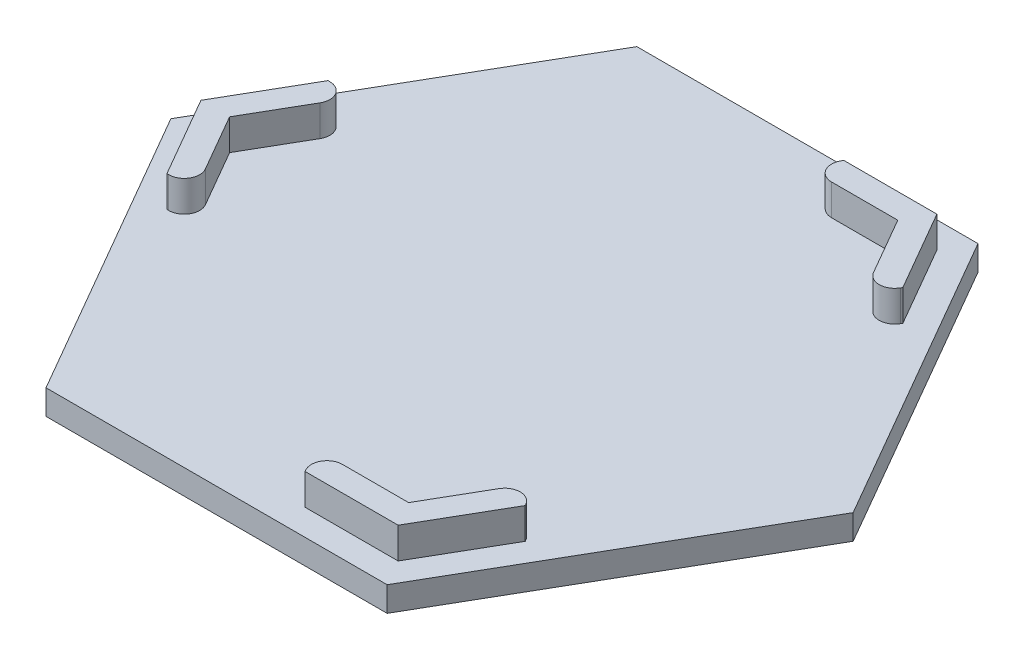
ISO-10303-21;
HEADER;
FILE_DESCRIPTION(('STEP AP214'),'2;1');
FILE_NAME('part.step','',(''),(''),'','','');
FILE_SCHEMA(('AUTOMOTIVE_DESIGN { 1 0 10303 214 1 1 1 1 }'));
ENDSEC;
DATA;
#1=APPLICATION_CONTEXT('core data for automotive mechanical design processes');
#2=APPLICATION_PROTOCOL_DEFINITION('international standard','automotive_design',2000,#1);
#3=PRODUCT_CONTEXT('',#1,'mechanical');
#4=PRODUCT('Part','Part','',(#3));
#5=PRODUCT_RELATED_PRODUCT_CATEGORY('part','',(#4));
#6=PRODUCT_DEFINITION_FORMATION('','',#4);
#7=PRODUCT_DEFINITION_CONTEXT('part definition',#1,'design');
#8=PRODUCT_DEFINITION('design','',#6,#7);
#9=PRODUCT_DEFINITION_SHAPE('','',#8);
#10=(LENGTH_UNIT() NAMED_UNIT(*) SI_UNIT(.MILLI.,.METRE.));
#11=(NAMED_UNIT(*) PLANE_ANGLE_UNIT() SI_UNIT($,.RADIAN.));
#12=(NAMED_UNIT(*) SI_UNIT($,.STERADIAN.) SOLID_ANGLE_UNIT());
#13=UNCERTAINTY_MEASURE_WITH_UNIT(LENGTH_MEASURE(1.E-05),#10,'distance_accuracy_value','');
#14=(GEOMETRIC_REPRESENTATION_CONTEXT(3) GLOBAL_UNCERTAINTY_ASSIGNED_CONTEXT((#13)) GLOBAL_UNIT_ASSIGNED_CONTEXT((#10,
#11,#12)) REPRESENTATION_CONTEXT('',''));
#15=CARTESIAN_POINT('',(0.,0.,0.));
#16=DIRECTION('',(0.,0.,1.));
#17=DIRECTION('',(1.,0.,0.));
#18=AXIS2_PLACEMENT_3D('',#15,#16,#17);
#19=CARTESIAN_POINT('',(0.,2.032,0.));
#20=DIRECTION('',(0.,1.,0.));
#21=DIRECTION('',(0.,0.,1.));
#22=AXIS2_PLACEMENT_3D('',#19,#20,#21);
#23=PLANE('',#22);
#24=DIRECTION('',(0.5,0.,-0.866025403784439));
#25=VECTOR('',#24,1.);
#26=CARTESIAN_POINT('',(13.97,2.032,24.1967497817372));
#27=LINE('',#26,#25);
#28=CARTESIAN_POINT('',(13.97,2.032,24.1967497817372));
#29=VERTEX_POINT('',#28);
#30=CARTESIAN_POINT('',(27.94,2.032,0.));
#31=VERTEX_POINT('',#30);
#32=EDGE_CURVE('E343',#29,#31,#27,.T.);
#33=ORIENTED_EDGE('',*,*,#32,.T.);
#34=DIRECTION('',(-0.5,0.,-0.866025403784439));
#35=VECTOR('',#34,1.);
#36=CARTESIAN_POINT('',(27.94,2.032,0.));
#37=LINE('',#36,#35);
#38=CARTESIAN_POINT('',(13.97,2.032,-24.1967497817372));
#39=VERTEX_POINT('',#38);
#40=EDGE_CURVE('E346',#31,#39,#37,.T.);
#41=ORIENTED_EDGE('',*,*,#40,.T.);
#42=DIRECTION('',(-1.,0.,0.));
#43=VECTOR('',#42,1.);
#44=CARTESIAN_POINT('',(13.97,2.032,-24.1967497817372));
#45=LINE('',#44,#43);
#46=CARTESIAN_POINT('',(-13.97,2.032,-24.1967497817372));
#47=VERTEX_POINT('',#46);
#48=EDGE_CURVE('E349',#39,#47,#45,.T.);
#49=ORIENTED_EDGE('',*,*,#48,.T.);
#50=DIRECTION('',(-0.5,0.,0.866025403784439));
#51=VECTOR('',#50,1.);
#52=CARTESIAN_POINT('',(-13.97,2.032,-24.1967497817372));
#53=LINE('',#52,#51);
#54=CARTESIAN_POINT('',(-27.94,2.032,0.));
#55=VERTEX_POINT('',#54);
#56=EDGE_CURVE('E351',#47,#55,#53,.T.);
#57=ORIENTED_EDGE('',*,*,#56,.T.);
#58=DIRECTION('',(0.5,0.,0.866025403784438));
#59=VECTOR('',#58,1.);
#60=CARTESIAN_POINT('',(-27.94,2.032,0.));
#61=LINE('',#60,#59);
#62=CARTESIAN_POINT('',(-13.97,2.032,24.1967497817372));
#63=VERTEX_POINT('',#62);
#64=EDGE_CURVE('E353',#55,#63,#61,.T.);
#65=ORIENTED_EDGE('',*,*,#64,.T.);
#66=DIRECTION('',(1.,0.,0.));
#67=VECTOR('',#66,1.);
#68=CARTESIAN_POINT('',(-13.97,2.032,24.1967497817372));
#69=LINE('',#68,#67);
#70=EDGE_CURVE('E355',#63,#29,#69,.T.);
#71=ORIENTED_EDGE('',*,*,#70,.T.);
#72=EDGE_LOOP('',(#33,#41,#49,#57,#65,#71));
#73=FACE_BOUND('',#72,.T.);
#74=DIRECTION('',(0.5,0.,-0.866025403784439));
#75=VECTOR('',#74,1.);
#76=CARTESIAN_POINT('',(15.3749897186637,2.032,-13.4320362048998));
#77=LINE('',#76,#75);
#78=CARTESIAN_POINT('',(16.4748419814699,2.032,-15.3370362048998));
#79=VERTEX_POINT('',#78);
#80=CARTESIAN_POINT('',(16.548165465657,2.032,-15.4640362048998));
#81=VERTEX_POINT('',#80);
#82=EDGE_CURVE('E322',#79,#81,#77,.T.);
#83=ORIENTED_EDGE('',*,*,#82,.F.);
#84=CARTESIAN_POINT('',(15.3749897186637,2.032,-15.9720362048998));
#85=DIRECTION('',(0.,1.,0.));
#86=DIRECTION('',(0.,0.,1.));
#87=AXIS2_PLACEMENT_3D('',#84,#85,#86);
#88=CIRCLE('',#87,1.27);
#89=CARTESIAN_POINT('',(14.2751374558575,2.032,-15.3370362048998));
#90=VERTEX_POINT('',#89);
#91=EDGE_CURVE('E41',#79,#90,#88,.F.);
#92=ORIENTED_EDGE('',*,*,#91,.T.);
#93=DIRECTION('',(0.5,0.,0.866025403784438));
#94=VECTOR('',#93,1.);
#95=CARTESIAN_POINT('',(11.5649897186637,2.032,-20.0311497817372));
#96=LINE('',#95,#94);
#97=CARTESIAN_POINT('',(11.5649897186637,2.032,-20.0311497817372));
#98=VERTEX_POINT('',#97);
#99=EDGE_CURVE('E303',#98,#90,#96,.T.);
#100=ORIENTED_EDGE('',*,*,#99,.F.);
#101=DIRECTION('',(1.,0.,0.));
#102=VECTOR('',#101,1.);
#103=CARTESIAN_POINT('',(3.94498971866369,2.032,-20.0311497817372));
#104=LINE('',#103,#102);
#105=CARTESIAN_POINT('',(6.14469424427617,2.032,-20.0311497817372));
#106=VERTEX_POINT('',#105);
#107=EDGE_CURVE('E308',#106,#98,#104,.T.);
#108=ORIENTED_EDGE('',*,*,#107,.F.);
#109=CARTESIAN_POINT('',(6.14469424427617,2.032,-21.3011497817372));
#110=DIRECTION('',(0.,1.,0.));
#111=DIRECTION('',(0.,0.,1.));
#112=AXIS2_PLACEMENT_3D('',#109,#110,#111);
#113=CIRCLE('',#112,1.27);
#114=CARTESIAN_POINT('',(5.04484198146993,2.032,-21.9361497817372));
#115=VERTEX_POINT('',#114);
#116=EDGE_CURVE('E11',#106,#115,#113,.F.);
#117=ORIENTED_EDGE('',*,*,#116,.T.);
#118=DIRECTION('',(-0.499999999999999,0.,0.866025403784439));
#119=VECTOR('',#118,1.);
#120=CARTESIAN_POINT('',(5.11816546565701,2.032,-22.0631497817372));
#121=LINE('',#120,#119);
#122=CARTESIAN_POINT('',(5.11816546565701,2.032,-22.0631497817372));
#123=VERTEX_POINT('',#122);
#124=EDGE_CURVE('E328',#123,#115,#121,.T.);
#125=ORIENTED_EDGE('',*,*,#124,.F.);
#126=DIRECTION('',(-1.,0.,0.));
#127=VECTOR('',#126,1.);
#128=CARTESIAN_POINT('',(5.11816546565701,2.032,-22.0631497817372));
#129=LINE('',#128,#127);
#130=CARTESIAN_POINT('',(12.738165465657,2.032,-22.0631497817372));
#131=VERTEX_POINT('',#130);
#132=EDGE_CURVE('E326',#131,#123,#129,.T.);
#133=ORIENTED_EDGE('',*,*,#132,.F.);
#134=DIRECTION('',(-0.5,0.,-0.866025403784439));
#135=VECTOR('',#134,1.);
#136=CARTESIAN_POINT('',(12.738165465657,2.032,-22.0631497817372));
#137=LINE('',#136,#135);
#138=EDGE_CURVE('E324',#81,#131,#137,.T.);
#139=ORIENTED_EDGE('',*,*,#138,.F.);
#140=EDGE_LOOP('',(#83,#92,#100,#108,#117,#125,#133,#139));
#141=FACE_BOUND('',#140,.T.);
#142=DIRECTION('',(-1.,0.,0.));
#143=VECTOR('',#142,1.);
#144=CARTESIAN_POINT('',(11.5649897186637,2.032,20.0311497817372));
#145=LINE('',#144,#143);
#146=CARTESIAN_POINT('',(11.5649897186637,2.032,20.0311497817372));
#147=VERTEX_POINT('',#146);
#148=CARTESIAN_POINT('',(6.14469424427618,2.032,20.0311497817372));
#149=VERTEX_POINT('',#148);
#150=EDGE_CURVE('E259',#147,#149,#145,.T.);
#151=ORIENTED_EDGE('',*,*,#150,.F.);
#152=DIRECTION('',(-0.499999999999999,0.,0.866025403784439));
#153=VECTOR('',#152,1.);
#154=CARTESIAN_POINT('',(15.3749897186637,2.032,13.4320362048998));
#155=LINE('',#154,#153);
#156=CARTESIAN_POINT('',(14.2751374558575,2.032,15.3370362048998));
#157=VERTEX_POINT('',#156);
#158=EDGE_CURVE('E256',#157,#147,#155,.T.);
#159=ORIENTED_EDGE('',*,*,#158,.F.);
#160=CARTESIAN_POINT('',(15.3749897186637,2.032,15.9720362048998));
#161=DIRECTION('',(0.,1.,0.));
#162=DIRECTION('',(0.,0.,1.));
#163=AXIS2_PLACEMENT_3D('',#160,#161,#162);
#164=CIRCLE('',#163,1.27);
#165=CARTESIAN_POINT('',(16.4748419814699,2.032,15.3370362048998));
#166=VERTEX_POINT('',#165);
#167=EDGE_CURVE('E430',#157,#166,#164,.F.);
#168=ORIENTED_EDGE('',*,*,#167,.T.);
#169=DIRECTION('',(-0.5,0.,-0.866025403784439));
#170=VECTOR('',#169,1.);
#171=CARTESIAN_POINT('',(16.548165465657,2.032,15.4640362048998));
#172=LINE('',#171,#170);
#173=CARTESIAN_POINT('',(16.548165465657,2.032,15.4640362048998));
#174=VERTEX_POINT('',#173);
#175=EDGE_CURVE('E269',#174,#166,#172,.T.);
#176=ORIENTED_EDGE('',*,*,#175,.F.);
#177=DIRECTION('',(0.5,0.,-0.866025403784439));
#178=VECTOR('',#177,1.);
#179=CARTESIAN_POINT('',(16.548165465657,2.032,15.4640362048998));
#180=LINE('',#179,#178);
#181=CARTESIAN_POINT('',(12.738165465657,2.032,22.0631497817372));
#182=VERTEX_POINT('',#181);
#183=EDGE_CURVE('E288',#182,#174,#180,.T.);
#184=ORIENTED_EDGE('',*,*,#183,.F.);
#185=DIRECTION('',(1.,0.,0.));
#186=VECTOR('',#185,1.);
#187=CARTESIAN_POINT('',(12.738165465657,2.032,22.0631497817372));
#188=LINE('',#187,#186);
#189=CARTESIAN_POINT('',(5.11816546565703,2.032,22.0631497817372));
#190=VERTEX_POINT('',#189);
#191=EDGE_CURVE('E286',#190,#182,#188,.T.);
#192=ORIENTED_EDGE('',*,*,#191,.F.);
#193=DIRECTION('',(0.500000000000001,0.,0.866025403784438));
#194=VECTOR('',#193,1.);
#195=CARTESIAN_POINT('',(3.94498971866371,2.032,20.0311497817372));
#196=LINE('',#195,#194);
#197=CARTESIAN_POINT('',(5.04484198146995,2.032,21.9361497817372));
#198=VERTEX_POINT('',#197);
#199=EDGE_CURVE('E284',#198,#190,#196,.T.);
#200=ORIENTED_EDGE('',*,*,#199,.F.);
#201=CARTESIAN_POINT('',(6.14469424427618,2.032,21.3011497817372));
#202=DIRECTION('',(0.,1.,0.));
#203=DIRECTION('',(0.,0.,1.));
#204=AXIS2_PLACEMENT_3D('',#201,#202,#203);
#205=CIRCLE('',#204,1.27);
#206=EDGE_CURVE('E428',#198,#149,#205,.F.);
#207=ORIENTED_EDGE('',*,*,#206,.T.);
#208=EDGE_LOOP('',(#151,#159,#168,#176,#184,#192,#200,#207));
#209=FACE_BOUND('',#208,.T.);
#210=DIRECTION('',(0.5,0.,-0.866025403784439));
#211=VECTOR('',#210,1.);
#212=CARTESIAN_POINT('',(-23.1299794373274,2.032,0.));
#213=LINE('',#212,#211);
#214=CARTESIAN_POINT('',(-23.1299794373274,2.032,0.));
#215=VERTEX_POINT('',#214);
#216=CARTESIAN_POINT('',(-20.4198317001336,2.032,-4.69411357683741));
#217=VERTEX_POINT('',#216);
#218=EDGE_CURVE('E812',#215,#217,#213,.T.);
#219=ORIENTED_EDGE('',*,*,#218,.F.);
#220=DIRECTION('',(-0.500000000000001,0.,-0.866025403784438));
#221=VECTOR('',#220,1.);
#222=CARTESIAN_POINT('',(-19.3199794373274,2.032,6.59911357683744));
#223=LINE('',#222,#221);
#224=CARTESIAN_POINT('',(-20.4198317001336,2.032,4.69411357683744));
#225=VERTEX_POINT('',#224);
#226=EDGE_CURVE('E255',#225,#215,#223,.T.);
#227=ORIENTED_EDGE('',*,*,#226,.F.);
#228=CARTESIAN_POINT('',(-21.5196839629399,2.032,5.32911357683744));
#229=DIRECTION('',(0.,1.,0.));
#230=DIRECTION('',(0.,0.,1.));
#231=AXIS2_PLACEMENT_3D('',#228,#229,#230);
#232=CIRCLE('',#231,1.27);
#233=CARTESIAN_POINT('',(-21.5196839629399,2.032,6.59911357683744));
#234=VERTEX_POINT('',#233);
#235=EDGE_CURVE('E426',#225,#234,#232,.F.);
#236=ORIENTED_EDGE('',*,*,#235,.T.);
#237=DIRECTION('',(1.,0.,0.));
#238=VECTOR('',#237,1.);
#239=CARTESIAN_POINT('',(-21.666330931314,2.032,6.59911357683744));
#240=LINE('',#239,#238);
#241=CARTESIAN_POINT('',(-21.666330931314,2.032,6.59911357683744));
#242=VERTEX_POINT('',#241);
#243=EDGE_CURVE('E241',#242,#234,#240,.T.);
#244=ORIENTED_EDGE('',*,*,#243,.F.);
#245=DIRECTION('',(0.499999999999999,0.,0.866025403784439));
#246=VECTOR('',#245,1.);
#247=CARTESIAN_POINT('',(-21.666330931314,2.032,6.59911357683744));
#248=LINE('',#247,#246);
#249=CARTESIAN_POINT('',(-25.476330931314,2.032,0.));
#250=VERTEX_POINT('',#249);
#251=EDGE_CURVE('E822',#250,#242,#248,.T.);
#252=ORIENTED_EDGE('',*,*,#251,.F.);
#253=DIRECTION('',(-0.499999999999999,0.,0.866025403784439));
#254=VECTOR('',#253,1.);
#255=CARTESIAN_POINT('',(-25.476330931314,2.032,0.));
#256=LINE('',#255,#254);
#257=CARTESIAN_POINT('',(-21.666330931314,2.032,-6.5991135768374));
#258=VERTEX_POINT('',#257);
#259=EDGE_CURVE('E816',#258,#250,#256,.T.);
#260=ORIENTED_EDGE('',*,*,#259,.F.);
#261=DIRECTION('',(-1.,0.,0.));
#262=VECTOR('',#261,1.);
#263=CARTESIAN_POINT('',(-19.3199794373274,2.032,-6.59911357683741));
#264=LINE('',#263,#262);
#265=CARTESIAN_POINT('',(-21.5196839629399,2.032,-6.5991135768374));
#266=VERTEX_POINT('',#265);
#267=EDGE_CURVE('E814',#266,#258,#264,.T.);
#268=ORIENTED_EDGE('',*,*,#267,.F.);
#269=CARTESIAN_POINT('',(-21.5196839629399,2.032,-5.3291135768374));
#270=DIRECTION('',(0.,1.,0.));
#271=DIRECTION('',(0.,0.,1.));
#272=AXIS2_PLACEMENT_3D('',#269,#270,#271);
#273=CIRCLE('',#272,1.27);
#274=EDGE_CURVE('E424',#266,#217,#273,.F.);
#275=ORIENTED_EDGE('',*,*,#274,.T.);
#276=EDGE_LOOP('',(#219,#227,#236,#244,#252,#260,#268,#275));
#277=FACE_BOUND('',#276,.T.);
#278=ADVANCED_FACE('F33',(#73,#141,#209,#277),#23,.T.);
#279=CARTESIAN_POINT('',(13.97,2.032,24.1967497817372));
#280=DIRECTION('',(-0.866025403784439,0.,-0.5));
#281=DIRECTION('',(-0.5,0.,0.866025403784439));
#282=AXIS2_PLACEMENT_3D('',#279,#280,#281);
#283=PLANE('',#282);
#284=DIRECTION('',(0.5,0.,-0.866025403784439));
#285=VECTOR('',#284,1.);
#286=CARTESIAN_POINT('',(13.97,0.,24.1967497817372));
#287=LINE('',#286,#285);
#288=CARTESIAN_POINT('',(13.97,0.,24.1967497817372));
#289=VERTEX_POINT('',#288);
#290=CARTESIAN_POINT('',(27.94,0.,0.));
#291=VERTEX_POINT('',#290);
#292=EDGE_CURVE('E342',#289,#291,#287,.T.);
#293=ORIENTED_EDGE('',*,*,#292,.T.);
#294=DIRECTION('',(0.,-1.,0.));
#295=VECTOR('',#294,1.);
#296=CARTESIAN_POINT('',(27.94,2.032,0.));
#297=LINE('',#296,#295);
#298=EDGE_CURVE('E383',#31,#291,#297,.T.);
#299=ORIENTED_EDGE('',*,*,#298,.F.);
#300=ORIENTED_EDGE('',*,*,#32,.F.);
#301=DIRECTION('',(0.,-1.,0.));
#302=VECTOR('',#301,1.);
#303=CARTESIAN_POINT('',(13.97,2.032,24.1967497817372));
#304=LINE('',#303,#302);
#305=EDGE_CURVE('E357',#29,#289,#304,.T.);
#306=ORIENTED_EDGE('',*,*,#305,.T.);
#307=EDGE_LOOP('',(#293,#299,#300,#306));
#308=FACE_BOUND('',#307,.T.);
#309=ADVANCED_FACE('F476',(#308),#283,.F.);
#310=CARTESIAN_POINT('',(27.94,2.032,0.));
#311=DIRECTION('',(-0.866025403784439,0.,0.5));
#312=DIRECTION('',(0.5,0.,0.866025403784439));
#313=AXIS2_PLACEMENT_3D('',#310,#311,#312);
#314=PLANE('',#313);
#315=DIRECTION('',(-0.5,0.,-0.866025403784439));
#316=VECTOR('',#315,1.);
#317=CARTESIAN_POINT('',(27.94,0.,0.));
#318=LINE('',#317,#316);
#319=CARTESIAN_POINT('',(13.97,0.,-24.1967497817372));
#320=VERTEX_POINT('',#319);
#321=EDGE_CURVE('E360',#291,#320,#318,.T.);
#322=ORIENTED_EDGE('',*,*,#321,.T.);
#323=DIRECTION('',(0.,-1.,0.));
#324=VECTOR('',#323,1.);
#325=CARTESIAN_POINT('',(13.97,2.032,-24.1967497817372));
#326=LINE('',#325,#324);
#327=EDGE_CURVE('E380',#39,#320,#326,.T.);
#328=ORIENTED_EDGE('',*,*,#327,.F.);
#329=ORIENTED_EDGE('',*,*,#40,.F.);
#330=ORIENTED_EDGE('',*,*,#298,.T.);
#331=EDGE_LOOP('',(#322,#328,#329,#330));
#332=FACE_BOUND('',#331,.T.);
#333=ADVANCED_FACE('F482',(#332),#314,.F.);
#334=CARTESIAN_POINT('',(13.97,2.032,-24.1967497817372));
#335=DIRECTION('',(0.,0.,1.));
#336=DIRECTION('',(1.,0.,0.));
#337=AXIS2_PLACEMENT_3D('',#334,#335,#336);
#338=PLANE('',#337);
#339=DIRECTION('',(-1.,0.,0.));
#340=VECTOR('',#339,1.);
#341=CARTESIAN_POINT('',(13.97,0.,-24.1967497817372));
#342=LINE('',#341,#340);
#343=CARTESIAN_POINT('',(-13.97,0.,-24.1967497817372));
#344=VERTEX_POINT('',#343);
#345=EDGE_CURVE('E362',#320,#344,#342,.T.);
#346=ORIENTED_EDGE('',*,*,#345,.T.);
#347=DIRECTION('',(0.,-1.,0.));
#348=VECTOR('',#347,1.);
#349=CARTESIAN_POINT('',(-13.97,2.032,-24.1967497817372));
#350=LINE('',#349,#348);
#351=EDGE_CURVE('E377',#47,#344,#350,.T.);
#352=ORIENTED_EDGE('',*,*,#351,.F.);
#353=ORIENTED_EDGE('',*,*,#48,.F.);
#354=ORIENTED_EDGE('',*,*,#327,.T.);
#355=EDGE_LOOP('',(#346,#352,#353,#354));
#356=FACE_BOUND('',#355,.T.);
#357=ADVANCED_FACE('F503',(#356),#338,.F.);
#358=CARTESIAN_POINT('',(-13.97,2.032,-24.1967497817372));
#359=DIRECTION('',(0.866025403784439,0.,0.5));
#360=DIRECTION('',(0.5,0.,-0.866025403784439));
#361=AXIS2_PLACEMENT_3D('',#358,#359,#360);
#362=PLANE('',#361);
#363=DIRECTION('',(-0.5,0.,0.866025403784439));
#364=VECTOR('',#363,1.);
#365=CARTESIAN_POINT('',(-13.97,0.,-24.1967497817372));
#366=LINE('',#365,#364);
#367=CARTESIAN_POINT('',(-27.94,0.,0.));
#368=VERTEX_POINT('',#367);
#369=EDGE_CURVE('E364',#344,#368,#366,.T.);
#370=ORIENTED_EDGE('',*,*,#369,.T.);
#371=DIRECTION('',(0.,-1.,0.));
#372=VECTOR('',#371,1.);
#373=CARTESIAN_POINT('',(-27.94,2.032,0.));
#374=LINE('',#373,#372);
#375=EDGE_CURVE('E374',#55,#368,#374,.T.);
#376=ORIENTED_EDGE('',*,*,#375,.F.);
#377=ORIENTED_EDGE('',*,*,#56,.F.);
#378=ORIENTED_EDGE('',*,*,#351,.T.);
#379=EDGE_LOOP('',(#370,#376,#377,#378));
#380=FACE_BOUND('',#379,.T.);
#381=ADVANCED_FACE('F499',(#380),#362,.F.);
#382=CARTESIAN_POINT('',(-27.94,2.032,0.));
#383=DIRECTION('',(0.866025403784438,0.,-0.5));
#384=DIRECTION('',(-0.5,0.,-0.866025403784439));
#385=AXIS2_PLACEMENT_3D('',#382,#383,#384);
#386=PLANE('',#385);
#387=DIRECTION('',(0.5,0.,0.866025403784438));
#388=VECTOR('',#387,1.);
#389=CARTESIAN_POINT('',(-27.94,0.,0.));
#390=LINE('',#389,#388);
#391=CARTESIAN_POINT('',(-13.97,0.,24.1967497817372));
#392=VERTEX_POINT('',#391);
#393=EDGE_CURVE('E366',#368,#392,#390,.T.);
#394=ORIENTED_EDGE('',*,*,#393,.T.);
#395=DIRECTION('',(0.,-1.,0.));
#396=VECTOR('',#395,1.);
#397=CARTESIAN_POINT('',(-13.97,2.032,24.1967497817372));
#398=LINE('',#397,#396);
#399=EDGE_CURVE('E371',#63,#392,#398,.T.);
#400=ORIENTED_EDGE('',*,*,#399,.F.);
#401=ORIENTED_EDGE('',*,*,#64,.F.);
#402=ORIENTED_EDGE('',*,*,#375,.T.);
#403=EDGE_LOOP('',(#394,#400,#401,#402));
#404=FACE_BOUND('',#403,.T.);
#405=ADVANCED_FACE('F495',(#404),#386,.F.);
#406=CARTESIAN_POINT('',(-13.97,2.032,24.1967497817372));
#407=DIRECTION('',(0.,0.,-1.));
#408=DIRECTION('',(-1.,0.,0.));
#409=AXIS2_PLACEMENT_3D('',#406,#407,#408);
#410=PLANE('',#409);
#411=DIRECTION('',(1.,0.,0.));
#412=VECTOR('',#411,1.);
#413=CARTESIAN_POINT('',(-13.97,0.,24.1967497817372));
#414=LINE('',#413,#412);
#415=EDGE_CURVE('E347',#392,#289,#414,.T.);
#416=ORIENTED_EDGE('',*,*,#415,.T.);
#417=ORIENTED_EDGE('',*,*,#305,.F.);
#418=ORIENTED_EDGE('',*,*,#70,.F.);
#419=ORIENTED_EDGE('',*,*,#399,.T.);
#420=EDGE_LOOP('',(#416,#417,#418,#419));
#421=FACE_BOUND('',#420,.T.);
#422=ADVANCED_FACE('F491',(#421),#410,.F.);
#423=CARTESIAN_POINT('',(0.,0.,0.));
#424=DIRECTION('',(0.,1.,0.));
#425=DIRECTION('',(0.,0.,1.));
#426=AXIS2_PLACEMENT_3D('',#423,#424,#425);
#427=PLANE('',#426);
#428=ORIENTED_EDGE('',*,*,#292,.F.);
#429=ORIENTED_EDGE('',*,*,#415,.F.);
#430=ORIENTED_EDGE('',*,*,#393,.F.);
#431=ORIENTED_EDGE('',*,*,#369,.F.);
#432=ORIENTED_EDGE('',*,*,#345,.F.);
#433=ORIENTED_EDGE('',*,*,#321,.F.);
#434=EDGE_LOOP('',(#428,#429,#430,#431,#432,#433));
#435=FACE_BOUND('',#434,.T.);
#436=ADVANCED_FACE('F488',(#435),#427,.F.);
#437=CARTESIAN_POINT('',(11.5649897186637,4.572,-20.0311497817372));
#438=DIRECTION('',(0.866025403784438,0.,-0.5));
#439=DIRECTION('',(-0.5,0.,-0.866025403784439));
#440=AXIS2_PLACEMENT_3D('',#437,#438,#439);
#441=PLANE('',#440);
#442=ORIENTED_EDGE('',*,*,#99,.T.);
#443=DIRECTION('',(0.,-1.,0.));
#444=VECTOR('',#443,1.);
#445=CARTESIAN_POINT('',(14.2751374558575,4.572,-15.3370362048998));
#446=LINE('',#445,#444);
#447=CARTESIAN_POINT('',(14.2751374558575,4.572,-15.3370362048998));
#448=VERTEX_POINT('',#447);
#449=EDGE_CURVE('E414',#90,#448,#446,.F.);
#450=ORIENTED_EDGE('',*,*,#449,.T.);
#451=DIRECTION('',(0.5,0.,0.866025403784438));
#452=VECTOR('',#451,1.);
#453=CARTESIAN_POINT('',(11.5649897186637,4.572,-20.0311497817372));
#454=LINE('',#453,#452);
#455=CARTESIAN_POINT('',(11.5649897186637,4.572,-20.0311497817372));
#456=VERTEX_POINT('',#455);
#457=EDGE_CURVE('E304',#456,#448,#454,.T.);
#458=ORIENTED_EDGE('',*,*,#457,.F.);
#459=DIRECTION('',(0.,-1.,0.));
#460=VECTOR('',#459,1.);
#461=CARTESIAN_POINT('',(11.5649897186637,4.572,-20.0311497817372));
#462=LINE('',#461,#460);
#463=EDGE_CURVE('E319',#456,#98,#462,.T.);
#464=ORIENTED_EDGE('',*,*,#463,.T.);
#465=EDGE_LOOP('',(#442,#450,#458,#464));
#466=FACE_BOUND('',#465,.T.);
#467=ADVANCED_FACE('F439',(#466),#441,.F.);
#468=CARTESIAN_POINT('',(15.3749897186637,4.572,-13.4320362048998));
#469=DIRECTION('',(-0.866025403784439,0.,-0.5));
#470=DIRECTION('',(-0.5,0.,0.866025403784439));
#471=AXIS2_PLACEMENT_3D('',#468,#469,#470);
#472=PLANE('',#471);
#473=DIRECTION('',(0.5,0.,-0.866025403784439));
#474=VECTOR('',#473,1.);
#475=CARTESIAN_POINT('',(15.3749897186637,4.572,-13.4320362048998));
#476=LINE('',#475,#474);
#477=CARTESIAN_POINT('',(16.4748419814699,4.572,-15.3370362048998));
#478=VERTEX_POINT('',#477);
#479=CARTESIAN_POINT('',(16.548165465657,4.572,-15.4640362048998));
#480=VERTEX_POINT('',#479);
#481=EDGE_CURVE('E307',#478,#480,#476,.T.);
#482=ORIENTED_EDGE('',*,*,#481,.F.);
#483=DIRECTION('',(0.,-1.,0.));
#484=VECTOR('',#483,1.);
#485=CARTESIAN_POINT('',(16.4748419814699,4.572,-15.3370362048998));
#486=LINE('',#485,#484);
#487=EDGE_CURVE('E411',#478,#79,#486,.T.);
#488=ORIENTED_EDGE('',*,*,#487,.T.);
#489=ORIENTED_EDGE('',*,*,#82,.T.);
#490=DIRECTION('',(0.,-1.,0.));
#491=VECTOR('',#490,1.);
#492=CARTESIAN_POINT('',(16.548165465657,4.572,-15.4640362048998));
#493=LINE('',#492,#491);
#494=EDGE_CURVE('E339',#480,#81,#493,.T.);
#495=ORIENTED_EDGE('',*,*,#494,.F.);
#496=EDGE_LOOP('',(#482,#488,#489,#495));
#497=FACE_BOUND('',#496,.T.);
#498=ADVANCED_FACE('F449',(#497),#472,.F.);
#499=CARTESIAN_POINT('',(12.738165465657,4.572,-22.0631497817372));
#500=DIRECTION('',(-0.866025403784439,0.,0.5));
#501=DIRECTION('',(0.5,0.,0.866025403784439));
#502=AXIS2_PLACEMENT_3D('',#499,#500,#501);
#503=PLANE('',#502);
#504=ORIENTED_EDGE('',*,*,#138,.T.);
#505=DIRECTION('',(0.,-1.,0.));
#506=VECTOR('',#505,1.);
#507=CARTESIAN_POINT('',(12.738165465657,4.572,-22.0631497817372));
#508=LINE('',#507,#506);
#509=CARTESIAN_POINT('',(12.738165465657,4.572,-22.0631497817372));
#510=VERTEX_POINT('',#509);
#511=EDGE_CURVE('E336',#510,#131,#508,.T.);
#512=ORIENTED_EDGE('',*,*,#511,.F.);
#513=DIRECTION('',(-0.5,0.,-0.866025403784439));
#514=VECTOR('',#513,1.);
#515=CARTESIAN_POINT('',(12.738165465657,4.572,-22.0631497817372));
#516=LINE('',#515,#514);
#517=EDGE_CURVE('E310',#480,#510,#516,.T.);
#518=ORIENTED_EDGE('',*,*,#517,.F.);
#519=ORIENTED_EDGE('',*,*,#494,.T.);
#520=EDGE_LOOP('',(#504,#512,#518,#519));
#521=FACE_BOUND('',#520,.T.);
#522=ADVANCED_FACE('F453',(#521),#503,.F.);
#523=CARTESIAN_POINT('',(5.11816546565701,4.572,-22.0631497817372));
#524=DIRECTION('',(0.,0.,1.));
#525=DIRECTION('',(1.,0.,0.));
#526=AXIS2_PLACEMENT_3D('',#523,#524,#525);
#527=PLANE('',#526);
#528=ORIENTED_EDGE('',*,*,#132,.T.);
#529=DIRECTION('',(0.,-1.,0.));
#530=VECTOR('',#529,1.);
#531=CARTESIAN_POINT('',(5.11816546565701,4.572,-22.0631497817372));
#532=LINE('',#531,#530);
#533=CARTESIAN_POINT('',(5.11816546565701,4.572,-22.0631497817372));
#534=VERTEX_POINT('',#533);
#535=EDGE_CURVE('E333',#534,#123,#532,.T.);
#536=ORIENTED_EDGE('',*,*,#535,.F.);
#537=DIRECTION('',(-1.,0.,0.));
#538=VECTOR('',#537,1.);
#539=CARTESIAN_POINT('',(5.11816546565701,4.572,-22.0631497817372));
#540=LINE('',#539,#538);
#541=EDGE_CURVE('E312',#510,#534,#540,.T.);
#542=ORIENTED_EDGE('',*,*,#541,.F.);
#543=ORIENTED_EDGE('',*,*,#511,.T.);
#544=EDGE_LOOP('',(#528,#536,#542,#543));
#545=FACE_BOUND('',#544,.T.);
#546=ADVANCED_FACE('F459',(#545),#527,.F.);
#547=CARTESIAN_POINT('',(5.11816546565701,4.572,-22.0631497817372));
#548=DIRECTION('',(0.866025403784439,0.,0.499999999999999));
#549=DIRECTION('',(0.499999999999999,0.,-0.866025403784439));
#550=AXIS2_PLACEMENT_3D('',#547,#548,#549);
#551=PLANE('',#550);
#552=ORIENTED_EDGE('',*,*,#124,.T.);
#553=DIRECTION('',(0.,-1.,0.));
#554=VECTOR('',#553,1.);
#555=CARTESIAN_POINT('',(5.04484198146993,4.572,-21.9361497817372));
#556=LINE('',#555,#554);
#557=CARTESIAN_POINT('',(5.04484198146993,4.572,-21.9361497817372));
#558=VERTEX_POINT('',#557);
#559=EDGE_CURVE('E422',#115,#558,#556,.F.);
#560=ORIENTED_EDGE('',*,*,#559,.T.);
#561=DIRECTION('',(-0.499999999999999,0.,0.866025403784439));
#562=VECTOR('',#561,1.);
#563=CARTESIAN_POINT('',(5.11816546565701,4.572,-22.0631497817372));
#564=LINE('',#563,#562);
#565=EDGE_CURVE('E314',#534,#558,#564,.T.);
#566=ORIENTED_EDGE('',*,*,#565,.F.);
#567=ORIENTED_EDGE('',*,*,#535,.T.);
#568=EDGE_LOOP('',(#552,#560,#566,#567));
#569=FACE_BOUND('',#568,.T.);
#570=ADVANCED_FACE('F462',(#569),#551,.F.);
#571=CARTESIAN_POINT('',(3.94498971866369,4.572,-20.0311497817372));
#572=DIRECTION('',(0.,0.,-1.));
#573=DIRECTION('',(-1.,0.,0.));
#574=AXIS2_PLACEMENT_3D('',#571,#572,#573);
#575=PLANE('',#574);
#576=DIRECTION('',(1.,0.,0.));
#577=VECTOR('',#576,1.);
#578=CARTESIAN_POINT('',(3.94498971866369,4.572,-20.0311497817372));
#579=LINE('',#578,#577);
#580=CARTESIAN_POINT('',(6.14469424427617,4.572,-20.0311497817372));
#581=VERTEX_POINT('',#580);
#582=EDGE_CURVE('E317',#581,#456,#579,.T.);
#583=ORIENTED_EDGE('',*,*,#582,.F.);
#584=DIRECTION('',(0.,-1.,0.));
#585=VECTOR('',#584,1.);
#586=CARTESIAN_POINT('',(6.14469424427617,4.572,-20.0311497817372));
#587=LINE('',#586,#585);
#588=EDGE_CURVE('E420',#581,#106,#587,.T.);
#589=ORIENTED_EDGE('',*,*,#588,.T.);
#590=ORIENTED_EDGE('',*,*,#107,.T.);
#591=ORIENTED_EDGE('',*,*,#463,.F.);
#592=EDGE_LOOP('',(#583,#589,#590,#591));
#593=FACE_BOUND('',#592,.T.);
#594=ADVANCED_FACE('F465',(#593),#575,.F.);
#595=CARTESIAN_POINT('',(0.,4.572,0.));
#596=DIRECTION('',(0.,1.,0.));
#597=DIRECTION('',(0.,0.,1.));
#598=AXIS2_PLACEMENT_3D('',#595,#596,#597);
#599=PLANE('',#598);
#600=ORIENTED_EDGE('',*,*,#457,.T.);
#601=CARTESIAN_POINT('',(15.3749897186637,4.572,-15.9720362048998));
#602=DIRECTION('',(0.,1.,0.));
#603=DIRECTION('',(0.,0.,1.));
#604=AXIS2_PLACEMENT_3D('',#601,#602,#603);
#605=CIRCLE('',#604,1.27);
#606=EDGE_CURVE('E418',#448,#478,#605,.T.);
#607=ORIENTED_EDGE('',*,*,#606,.T.);
#608=ORIENTED_EDGE('',*,*,#481,.T.);
#609=ORIENTED_EDGE('',*,*,#517,.T.);
#610=ORIENTED_EDGE('',*,*,#541,.T.);
#611=ORIENTED_EDGE('',*,*,#565,.T.);
#612=CARTESIAN_POINT('',(6.14469424427617,4.572,-21.3011497817372));
#613=DIRECTION('',(0.,1.,0.));
#614=DIRECTION('',(0.,0.,1.));
#615=AXIS2_PLACEMENT_3D('',#612,#613,#614);
#616=CIRCLE('',#615,1.27);
#617=EDGE_CURVE('E416',#558,#581,#616,.T.);
#618=ORIENTED_EDGE('',*,*,#617,.T.);
#619=ORIENTED_EDGE('',*,*,#582,.T.);
#620=EDGE_LOOP('',(#600,#607,#608,#609,#610,#611,#618,#619));
#621=FACE_BOUND('',#620,.T.);
#622=ADVANCED_FACE('F446',(#621),#599,.T.);
#623=CARTESIAN_POINT('',(15.3749897186637,4.572,13.4320362048998));
#624=DIRECTION('',(0.866025403784439,0.,0.499999999999999));
#625=DIRECTION('',(0.499999999999999,0.,-0.866025403784439));
#626=AXIS2_PLACEMENT_3D('',#623,#624,#625);
#627=PLANE('',#626);
#628=DIRECTION('',(-0.499999999999999,0.,0.866025403784439));
#629=VECTOR('',#628,1.);
#630=CARTESIAN_POINT('',(15.3749897186637,4.572,13.4320362048998));
#631=LINE('',#630,#629);
#632=CARTESIAN_POINT('',(14.2751374558575,4.572,15.3370362048998));
#633=VERTEX_POINT('',#632);
#634=CARTESIAN_POINT('',(11.5649897186637,4.572,20.0311497817372));
#635=VERTEX_POINT('',#634);
#636=EDGE_CURVE('E266',#633,#635,#631,.T.);
#637=ORIENTED_EDGE('',*,*,#636,.F.);
#638=DIRECTION('',(0.,-1.,0.));
#639=VECTOR('',#638,1.);
#640=CARTESIAN_POINT('',(14.2751374558575,4.572,15.3370362048998));
#641=LINE('',#640,#639);
#642=EDGE_CURVE('E406',#633,#157,#641,.T.);
#643=ORIENTED_EDGE('',*,*,#642,.T.);
#644=ORIENTED_EDGE('',*,*,#158,.T.);
#645=DIRECTION('',(0.,-1.,0.));
#646=VECTOR('',#645,1.);
#647=CARTESIAN_POINT('',(11.5649897186637,4.572,20.0311497817372));
#648=LINE('',#647,#646);
#649=EDGE_CURVE('E300',#635,#147,#648,.T.);
#650=ORIENTED_EDGE('',*,*,#649,.F.);
#651=EDGE_LOOP('',(#637,#643,#644,#650));
#652=FACE_BOUND('',#651,.T.);
#653=ADVANCED_FACE('F472',(#652),#627,.F.);
#654=CARTESIAN_POINT('',(11.5649897186637,4.572,20.0311497817372));
#655=DIRECTION('',(0.,0.,1.));
#656=DIRECTION('',(1.,0.,0.));
#657=AXIS2_PLACEMENT_3D('',#654,#655,#656);
#658=PLANE('',#657);
#659=ORIENTED_EDGE('',*,*,#150,.T.);
#660=DIRECTION('',(0.,-1.,0.));
#661=VECTOR('',#660,1.);
#662=CARTESIAN_POINT('',(6.14469424427618,4.572,20.0311497817372));
#663=LINE('',#662,#661);
#664=CARTESIAN_POINT('',(6.14469424427618,4.572,20.0311497817372));
#665=VERTEX_POINT('',#664);
#666=EDGE_CURVE('E400',#149,#665,#663,.F.);
#667=ORIENTED_EDGE('',*,*,#666,.T.);
#668=DIRECTION('',(-1.,0.,0.));
#669=VECTOR('',#668,1.);
#670=CARTESIAN_POINT('',(11.5649897186637,4.572,20.0311497817372));
#671=LINE('',#670,#669);
#672=EDGE_CURVE('E268',#635,#665,#671,.T.);
#673=ORIENTED_EDGE('',*,*,#672,.F.);
#674=ORIENTED_EDGE('',*,*,#649,.T.);
#675=EDGE_LOOP('',(#659,#667,#673,#674));
#676=FACE_BOUND('',#675,.T.);
#677=ADVANCED_FACE('F644',(#676),#658,.F.);
#678=CARTESIAN_POINT('',(3.94498971866371,4.572,20.0311497817372));
#679=DIRECTION('',(0.866025403784438,0.,-0.500000000000001));
#680=DIRECTION('',(-0.500000000000001,0.,-0.866025403784438));
#681=AXIS2_PLACEMENT_3D('',#678,#679,#680);
#682=PLANE('',#681);
#683=DIRECTION('',(0.500000000000001,0.,0.866025403784438));
#684=VECTOR('',#683,1.);
#685=CARTESIAN_POINT('',(3.94498971866371,4.572,20.0311497817372));
#686=LINE('',#685,#684);
#687=CARTESIAN_POINT('',(5.04484198146995,4.572,21.9361497817372));
#688=VERTEX_POINT('',#687);
#689=CARTESIAN_POINT('',(5.11816546565703,4.572,22.0631497817372));
#690=VERTEX_POINT('',#689);
#691=EDGE_CURVE('E272',#688,#690,#686,.T.);
#692=ORIENTED_EDGE('',*,*,#691,.F.);
#693=DIRECTION('',(0.,-1.,0.));
#694=VECTOR('',#693,1.);
#695=CARTESIAN_POINT('',(5.04484198146995,4.572,21.9361497817372));
#696=LINE('',#695,#694);
#697=EDGE_CURVE('E397',#688,#198,#696,.T.);
#698=ORIENTED_EDGE('',*,*,#697,.T.);
#699=ORIENTED_EDGE('',*,*,#199,.T.);
#700=DIRECTION('',(0.,-1.,0.));
#701=VECTOR('',#700,1.);
#702=CARTESIAN_POINT('',(5.11816546565703,4.572,22.0631497817372));
#703=LINE('',#702,#701);
#704=EDGE_CURVE('E297',#690,#190,#703,.T.);
#705=ORIENTED_EDGE('',*,*,#704,.F.);
#706=EDGE_LOOP('',(#692,#698,#699,#705));
#707=FACE_BOUND('',#706,.T.);
#708=ADVANCED_FACE('F638',(#707),#682,.F.);
#709=CARTESIAN_POINT('',(12.738165465657,4.572,22.0631497817372));
#710=DIRECTION('',(0.,0.,-1.));
#711=DIRECTION('',(-1.,0.,0.));
#712=AXIS2_PLACEMENT_3D('',#709,#710,#711);
#713=PLANE('',#712);
#714=ORIENTED_EDGE('',*,*,#191,.T.);
#715=DIRECTION('',(0.,-1.,0.));
#716=VECTOR('',#715,1.);
#717=CARTESIAN_POINT('',(12.738165465657,4.572,22.0631497817372));
#718=LINE('',#717,#716);
#719=CARTESIAN_POINT('',(12.738165465657,4.572,22.0631497817372));
#720=VERTEX_POINT('',#719);
#721=EDGE_CURVE('E294',#720,#182,#718,.T.);
#722=ORIENTED_EDGE('',*,*,#721,.F.);
#723=DIRECTION('',(1.,0.,0.));
#724=VECTOR('',#723,1.);
#725=CARTESIAN_POINT('',(12.738165465657,4.572,22.0631497817372));
#726=LINE('',#725,#724);
#727=EDGE_CURVE('E274',#690,#720,#726,.T.);
#728=ORIENTED_EDGE('',*,*,#727,.F.);
#729=ORIENTED_EDGE('',*,*,#704,.T.);
#730=EDGE_LOOP('',(#714,#722,#728,#729));
#731=FACE_BOUND('',#730,.T.);
#732=ADVANCED_FACE('F643',(#731),#713,.F.);
#733=CARTESIAN_POINT('',(16.548165465657,4.572,15.4640362048998));
#734=DIRECTION('',(-0.866025403784439,0.,-0.5));
#735=DIRECTION('',(-0.5,0.,0.866025403784439));
#736=AXIS2_PLACEMENT_3D('',#733,#734,#735);
#737=PLANE('',#736);
#738=ORIENTED_EDGE('',*,*,#183,.T.);
#739=DIRECTION('',(0.,-1.,0.));
#740=VECTOR('',#739,1.);
#741=CARTESIAN_POINT('',(16.548165465657,4.572,15.4640362048998));
#742=LINE('',#741,#740);
#743=CARTESIAN_POINT('',(16.548165465657,4.572,15.4640362048998));
#744=VERTEX_POINT('',#743);
#745=EDGE_CURVE('E280',#744,#174,#742,.T.);
#746=ORIENTED_EDGE('',*,*,#745,.F.);
#747=DIRECTION('',(0.5,0.,-0.866025403784439));
#748=VECTOR('',#747,1.);
#749=CARTESIAN_POINT('',(16.548165465657,4.572,15.4640362048998));
#750=LINE('',#749,#748);
#751=EDGE_CURVE('E276',#720,#744,#750,.T.);
#752=ORIENTED_EDGE('',*,*,#751,.F.);
#753=ORIENTED_EDGE('',*,*,#721,.T.);
#754=EDGE_LOOP('',(#738,#746,#752,#753));
#755=FACE_BOUND('',#754,.T.);
#756=ADVANCED_FACE('F630',(#755),#737,.F.);
#757=CARTESIAN_POINT('',(16.548165465657,4.572,15.4640362048998));
#758=DIRECTION('',(-0.866025403784439,0.,0.5));
#759=DIRECTION('',(0.5,0.,0.866025403784439));
#760=AXIS2_PLACEMENT_3D('',#757,#758,#759);
#761=PLANE('',#760);
#762=ORIENTED_EDGE('',*,*,#175,.T.);
#763=DIRECTION('',(0.,-1.,0.));
#764=VECTOR('',#763,1.);
#765=CARTESIAN_POINT('',(16.4748419814699,4.572,15.3370362048998));
#766=LINE('',#765,#764);
#767=CARTESIAN_POINT('',(16.4748419814699,4.572,15.3370362048998));
#768=VERTEX_POINT('',#767);
#769=EDGE_CURVE('E409',#166,#768,#766,.F.);
#770=ORIENTED_EDGE('',*,*,#769,.T.);
#771=DIRECTION('',(-0.5,0.,-0.866025403784439));
#772=VECTOR('',#771,1.);
#773=CARTESIAN_POINT('',(16.548165465657,4.572,15.4640362048998));
#774=LINE('',#773,#772);
#775=EDGE_CURVE('E278',#744,#768,#774,.T.);
#776=ORIENTED_EDGE('',*,*,#775,.F.);
#777=ORIENTED_EDGE('',*,*,#745,.T.);
#778=EDGE_LOOP('',(#762,#770,#776,#777));
#779=FACE_BOUND('',#778,.T.);
#780=ADVANCED_FACE('F620',(#779),#761,.F.);
#781=CARTESIAN_POINT('',(0.,4.572,0.));
#782=DIRECTION('',(0.,-1.,0.));
#783=DIRECTION('',(0.,0.,-1.));
#784=AXIS2_PLACEMENT_3D('',#781,#782,#783);
#785=PLANE('',#784);
#786=ORIENTED_EDGE('',*,*,#672,.T.);
#787=CARTESIAN_POINT('',(6.14469424427618,4.572,21.3011497817372));
#788=DIRECTION('',(0.,-1.,0.));
#789=DIRECTION('',(0.,0.,-1.));
#790=AXIS2_PLACEMENT_3D('',#787,#788,#789);
#791=CIRCLE('',#790,1.27);
#792=EDGE_CURVE('E404',#665,#688,#791,.F.);
#793=ORIENTED_EDGE('',*,*,#792,.T.);
#794=ORIENTED_EDGE('',*,*,#691,.T.);
#795=ORIENTED_EDGE('',*,*,#727,.T.);
#796=ORIENTED_EDGE('',*,*,#751,.T.);
#797=ORIENTED_EDGE('',*,*,#775,.T.);
#798=CARTESIAN_POINT('',(15.3749897186637,4.572,15.9720362048998));
#799=DIRECTION('',(0.,-1.,0.));
#800=DIRECTION('',(0.,0.,-1.));
#801=AXIS2_PLACEMENT_3D('',#798,#799,#800);
#802=CIRCLE('',#801,1.27);
#803=EDGE_CURVE('E402',#768,#633,#802,.F.);
#804=ORIENTED_EDGE('',*,*,#803,.T.);
#805=ORIENTED_EDGE('',*,*,#636,.T.);
#806=EDGE_LOOP('',(#786,#793,#794,#795,#796,#797,#804,#805));
#807=FACE_BOUND('',#806,.T.);
#808=ADVANCED_FACE('F611',(#807),#785,.F.);
#809=CARTESIAN_POINT('',(-19.3199794373274,4.572,6.59911357683744));
#810=DIRECTION('',(-0.866025403784438,0.,0.500000000000001));
#811=DIRECTION('',(0.500000000000001,0.,0.866025403784438));
#812=AXIS2_PLACEMENT_3D('',#809,#810,#811);
#813=PLANE('',#812);
#814=DIRECTION('',(-0.500000000000001,0.,-0.866025403784438));
#815=VECTOR('',#814,1.);
#816=CARTESIAN_POINT('',(-19.3199794373274,4.572,6.59911357683744));
#817=LINE('',#816,#815);
#818=CARTESIAN_POINT('',(-20.4198317001336,4.572,4.69411357683744));
#819=VERTEX_POINT('',#818);
#820=CARTESIAN_POINT('',(-23.1299794373274,4.572,0.));
#821=VERTEX_POINT('',#820);
#822=EDGE_CURVE('E229',#819,#821,#817,.T.);
#823=ORIENTED_EDGE('',*,*,#822,.F.);
#824=DIRECTION('',(0.,-1.,0.));
#825=VECTOR('',#824,1.);
#826=CARTESIAN_POINT('',(-20.4198317001336,4.572,4.69411357683744));
#827=LINE('',#826,#825);
#828=EDGE_CURVE('E393',#819,#225,#827,.T.);
#829=ORIENTED_EDGE('',*,*,#828,.T.);
#830=ORIENTED_EDGE('',*,*,#226,.T.);
#831=DIRECTION('',(0.,-1.,0.));
#832=VECTOR('',#831,1.);
#833=CARTESIAN_POINT('',(-23.1299794373274,4.572,0.));
#834=LINE('',#833,#832);
#835=EDGE_CURVE('E247',#821,#215,#834,.T.);
#836=ORIENTED_EDGE('',*,*,#835,.F.);
#837=EDGE_LOOP('',(#823,#829,#830,#836));
#838=FACE_BOUND('',#837,.T.);
#839=ADVANCED_FACE('F253',(#838),#813,.F.);
#840=CARTESIAN_POINT('',(-23.1299794373274,4.572,0.));
#841=DIRECTION('',(-0.866025403784439,0.,-0.499999999999999));
#842=DIRECTION('',(-0.5,0.,0.866025403784439));
#843=AXIS2_PLACEMENT_3D('',#840,#841,#842);
#844=PLANE('',#843);
#845=ORIENTED_EDGE('',*,*,#218,.T.);
#846=DIRECTION('',(0.,-1.,0.));
#847=VECTOR('',#846,1.);
#848=CARTESIAN_POINT('',(-20.4198317001336,4.572,-4.69411357683741));
#849=LINE('',#848,#847);
#850=CARTESIAN_POINT('',(-20.4198317001336,4.572,-4.69411357683741));
#851=VERTEX_POINT('',#850);
#852=EDGE_CURVE('E250',#217,#851,#849,.F.);
#853=ORIENTED_EDGE('',*,*,#852,.T.);
#854=DIRECTION('',(0.5,0.,-0.866025403784439));
#855=VECTOR('',#854,1.);
#856=CARTESIAN_POINT('',(-23.1299794373274,4.572,0.));
#857=LINE('',#856,#855);
#858=EDGE_CURVE('E232',#821,#851,#857,.T.);
#859=ORIENTED_EDGE('',*,*,#858,.F.);
#860=ORIENTED_EDGE('',*,*,#835,.T.);
#861=EDGE_LOOP('',(#845,#853,#859,#860));
#862=FACE_BOUND('',#861,.T.);
#863=ADVANCED_FACE('F246',(#862),#844,.F.);
#864=CARTESIAN_POINT('',(-19.3199794373274,4.572,-6.59911357683741));
#865=DIRECTION('',(0.,0.,1.));
#866=DIRECTION('',(1.,0.,0.));
#867=AXIS2_PLACEMENT_3D('',#864,#865,#866);
#868=PLANE('',#867);
#869=DIRECTION('',(-1.,0.,0.));
#870=VECTOR('',#869,1.);
#871=CARTESIAN_POINT('',(-19.3199794373274,4.572,-6.59911357683741));
#872=LINE('',#871,#870);
#873=CARTESIAN_POINT('',(-21.5196839629399,4.572,-6.5991135768374));
#874=VERTEX_POINT('',#873);
#875=CARTESIAN_POINT('',(-21.666330931314,4.572,-6.5991135768374));
#876=VERTEX_POINT('',#875);
#877=EDGE_CURVE('E251',#874,#876,#872,.T.);
#878=ORIENTED_EDGE('',*,*,#877,.F.);
#879=DIRECTION('',(0.,-1.,0.));
#880=VECTOR('',#879,1.);
#881=CARTESIAN_POINT('',(-21.5196839629399,4.572,-6.5991135768374));
#882=LINE('',#881,#880);
#883=EDGE_CURVE('E386',#874,#266,#882,.T.);
#884=ORIENTED_EDGE('',*,*,#883,.T.);
#885=ORIENTED_EDGE('',*,*,#267,.T.);
#886=DIRECTION('',(0.,-1.,0.));
#887=VECTOR('',#886,1.);
#888=CARTESIAN_POINT('',(-21.666330931314,4.572,-6.5991135768374));
#889=LINE('',#888,#887);
#890=EDGE_CURVE('E257',#876,#258,#889,.T.);
#891=ORIENTED_EDGE('',*,*,#890,.F.);
#892=EDGE_LOOP('',(#878,#884,#885,#891));
#893=FACE_BOUND('',#892,.T.);
#894=ADVANCED_FACE('F586',(#893),#868,.F.);
#895=CARTESIAN_POINT('',(-25.476330931314,4.572,0.));
#896=DIRECTION('',(0.866025403784439,0.,0.499999999999999));
#897=DIRECTION('',(0.5,0.,-0.866025403784439));
#898=AXIS2_PLACEMENT_3D('',#895,#896,#897);
#899=PLANE('',#898);
#900=ORIENTED_EDGE('',*,*,#259,.T.);
#901=DIRECTION('',(0.,-1.,0.));
#902=VECTOR('',#901,1.);
#903=CARTESIAN_POINT('',(-25.476330931314,4.572,0.));
#904=LINE('',#903,#902);
#905=CARTESIAN_POINT('',(-25.476330931314,4.572,0.));
#906=VERTEX_POINT('',#905);
#907=EDGE_CURVE('E262',#906,#250,#904,.T.);
#908=ORIENTED_EDGE('',*,*,#907,.F.);
#909=DIRECTION('',(-0.499999999999999,0.,0.866025403784439));
#910=VECTOR('',#909,1.);
#911=CARTESIAN_POINT('',(-25.476330931314,4.572,0.));
#912=LINE('',#911,#910);
#913=EDGE_CURVE('E840',#876,#906,#912,.T.);
#914=ORIENTED_EDGE('',*,*,#913,.F.);
#915=ORIENTED_EDGE('',*,*,#890,.T.);
#916=EDGE_LOOP('',(#900,#908,#914,#915));
#917=FACE_BOUND('',#916,.T.);
#918=ADVANCED_FACE('F591',(#917),#899,.F.);
#919=CARTESIAN_POINT('',(-21.666330931314,4.572,6.59911357683744));
#920=DIRECTION('',(0.866025403784439,0.,-0.499999999999999));
#921=DIRECTION('',(-0.5,0.,-0.866025403784439));
#922=AXIS2_PLACEMENT_3D('',#919,#920,#921);
#923=PLANE('',#922);
#924=ORIENTED_EDGE('',*,*,#251,.T.);
#925=DIRECTION('',(0.,-1.,0.));
#926=VECTOR('',#925,1.);
#927=CARTESIAN_POINT('',(-21.666330931314,4.572,6.59911357683744));
#928=LINE('',#927,#926);
#929=CARTESIAN_POINT('',(-21.666330931314,4.572,6.59911357683744));
#930=VERTEX_POINT('',#929);
#931=EDGE_CURVE('E827',#930,#242,#928,.T.);
#932=ORIENTED_EDGE('',*,*,#931,.F.);
#933=DIRECTION('',(0.499999999999999,0.,0.866025403784439));
#934=VECTOR('',#933,1.);
#935=CARTESIAN_POINT('',(-21.666330931314,4.572,6.59911357683744));
#936=LINE('',#935,#934);
#937=EDGE_CURVE('E835',#906,#930,#936,.T.);
#938=ORIENTED_EDGE('',*,*,#937,.F.);
#939=ORIENTED_EDGE('',*,*,#907,.T.);
#940=EDGE_LOOP('',(#924,#932,#938,#939));
#941=FACE_BOUND('',#940,.T.);
#942=ADVANCED_FACE('F578',(#941),#923,.F.);
#943=CARTESIAN_POINT('',(-21.666330931314,4.572,6.59911357683744));
#944=DIRECTION('',(0.,0.,-1.));
#945=DIRECTION('',(-1.,0.,0.));
#946=AXIS2_PLACEMENT_3D('',#943,#944,#945);
#947=PLANE('',#946);
#948=ORIENTED_EDGE('',*,*,#243,.T.);
#949=DIRECTION('',(0.,-1.,0.));
#950=VECTOR('',#949,1.);
#951=CARTESIAN_POINT('',(-21.5196839629399,4.572,6.59911357683744));
#952=LINE('',#951,#950);
#953=CARTESIAN_POINT('',(-21.5196839629399,4.572,6.59911357683744));
#954=VERTEX_POINT('',#953);
#955=EDGE_CURVE('E395',#234,#954,#952,.F.);
#956=ORIENTED_EDGE('',*,*,#955,.T.);
#957=DIRECTION('',(1.,0.,0.));
#958=VECTOR('',#957,1.);
#959=CARTESIAN_POINT('',(-21.666330931314,4.572,6.59911357683744));
#960=LINE('',#959,#958);
#961=EDGE_CURVE('E828',#930,#954,#960,.T.);
#962=ORIENTED_EDGE('',*,*,#961,.F.);
#963=ORIENTED_EDGE('',*,*,#931,.T.);
#964=EDGE_LOOP('',(#948,#956,#962,#963));
#965=FACE_BOUND('',#964,.T.);
#966=ADVANCED_FACE('F569',(#965),#947,.F.);
#967=CARTESIAN_POINT('',(0.,4.572,0.));
#968=DIRECTION('',(0.,-1.,0.));
#969=DIRECTION('',(0.,0.,-1.));
#970=AXIS2_PLACEMENT_3D('',#967,#968,#969);
#971=PLANE('',#970);
#972=ORIENTED_EDGE('',*,*,#858,.T.);
#973=CARTESIAN_POINT('',(-21.5196839629399,4.572,-5.3291135768374));
#974=DIRECTION('',(0.,-1.,0.));
#975=DIRECTION('',(0.,0.,-1.));
#976=AXIS2_PLACEMENT_3D('',#973,#974,#975);
#977=CIRCLE('',#976,1.27);
#978=EDGE_CURVE('E391',#851,#874,#977,.F.);
#979=ORIENTED_EDGE('',*,*,#978,.T.);
#980=ORIENTED_EDGE('',*,*,#877,.T.);
#981=ORIENTED_EDGE('',*,*,#913,.T.);
#982=ORIENTED_EDGE('',*,*,#937,.T.);
#983=ORIENTED_EDGE('',*,*,#961,.T.);
#984=CARTESIAN_POINT('',(-21.5196839629399,4.572,5.32911357683744));
#985=DIRECTION('',(0.,-1.,0.));
#986=DIRECTION('',(0.,0.,-1.));
#987=AXIS2_PLACEMENT_3D('',#984,#985,#986);
#988=CIRCLE('',#987,1.27);
#989=EDGE_CURVE('E236',#954,#819,#988,.F.);
#990=ORIENTED_EDGE('',*,*,#989,.T.);
#991=ORIENTED_EDGE('',*,*,#822,.T.);
#992=EDGE_LOOP('',(#972,#979,#980,#981,#982,#983,#990,#991));
#993=FACE_BOUND('',#992,.T.);
#994=ADVANCED_FACE('F231',(#993),#971,.F.);
#995=CARTESIAN_POINT('',(-21.5196839629399,4.572,-5.3291135768374));
#996=DIRECTION('',(0.,-1.,0.));
#997=DIRECTION('',(0.,0.,-1.));
#998=AXIS2_PLACEMENT_3D('',#995,#996,#997);
#999=CYLINDRICAL_SURFACE('',#998,1.27);
#1000=ORIENTED_EDGE('',*,*,#978,.F.);
#1001=ORIENTED_EDGE('',*,*,#852,.F.);
#1002=ORIENTED_EDGE('',*,*,#274,.F.);
#1003=ORIENTED_EDGE('',*,*,#883,.F.);
#1004=EDGE_LOOP('',(#1000,#1001,#1002,#1003));
#1005=FACE_BOUND('',#1004,.T.);
#1006=ADVANCED_FACE('F511',(#1005),#999,.T.);
#1007=CARTESIAN_POINT('',(-21.5196839629399,4.572,5.32911357683744));
#1008=DIRECTION('',(0.,-1.,0.));
#1009=DIRECTION('',(0.,0.,-1.));
#1010=AXIS2_PLACEMENT_3D('',#1007,#1008,#1009);
#1011=CYLINDRICAL_SURFACE('',#1010,1.27);
#1012=ORIENTED_EDGE('',*,*,#989,.F.);
#1013=ORIENTED_EDGE('',*,*,#955,.F.);
#1014=ORIENTED_EDGE('',*,*,#235,.F.);
#1015=ORIENTED_EDGE('',*,*,#828,.F.);
#1016=EDGE_LOOP('',(#1012,#1013,#1014,#1015));
#1017=FACE_BOUND('',#1016,.T.);
#1018=ADVANCED_FACE('F514',(#1017),#1011,.T.);
#1019=CARTESIAN_POINT('',(6.14469424427618,4.572,21.3011497817372));
#1020=DIRECTION('',(0.,-1.,0.));
#1021=DIRECTION('',(0.,0.,-1.));
#1022=AXIS2_PLACEMENT_3D('',#1019,#1020,#1021);
#1023=CYLINDRICAL_SURFACE('',#1022,1.27);
#1024=ORIENTED_EDGE('',*,*,#792,.F.);
#1025=ORIENTED_EDGE('',*,*,#666,.F.);
#1026=ORIENTED_EDGE('',*,*,#206,.F.);
#1027=ORIENTED_EDGE('',*,*,#697,.F.);
#1028=EDGE_LOOP('',(#1024,#1025,#1026,#1027));
#1029=FACE_BOUND('',#1028,.T.);
#1030=ADVANCED_FACE('F518',(#1029),#1023,.T.);
#1031=CARTESIAN_POINT('',(15.3749897186637,4.572,15.9720362048998));
#1032=DIRECTION('',(0.,-1.,0.));
#1033=DIRECTION('',(0.,0.,-1.));
#1034=AXIS2_PLACEMENT_3D('',#1031,#1032,#1033);
#1035=CYLINDRICAL_SURFACE('',#1034,1.27);
#1036=ORIENTED_EDGE('',*,*,#803,.F.);
#1037=ORIENTED_EDGE('',*,*,#769,.F.);
#1038=ORIENTED_EDGE('',*,*,#167,.F.);
#1039=ORIENTED_EDGE('',*,*,#642,.F.);
#1040=EDGE_LOOP('',(#1036,#1037,#1038,#1039));
#1041=FACE_BOUND('',#1040,.T.);
#1042=ADVANCED_FACE('F522',(#1041),#1035,.T.);
#1043=CARTESIAN_POINT('',(15.3749897186637,4.572,-15.9720362048998));
#1044=DIRECTION('',(0.,-1.,0.));
#1045=DIRECTION('',(0.,0.,-1.));
#1046=AXIS2_PLACEMENT_3D('',#1043,#1044,#1045);
#1047=CYLINDRICAL_SURFACE('',#1046,1.27);
#1048=ORIENTED_EDGE('',*,*,#606,.F.);
#1049=ORIENTED_EDGE('',*,*,#449,.F.);
#1050=ORIENTED_EDGE('',*,*,#91,.F.);
#1051=ORIENTED_EDGE('',*,*,#487,.F.);
#1052=EDGE_LOOP('',(#1048,#1049,#1050,#1051));
#1053=FACE_BOUND('',#1052,.T.);
#1054=ADVANCED_FACE('F443',(#1053),#1047,.T.);
#1055=CARTESIAN_POINT('',(6.14469424427617,4.572,-21.3011497817372));
#1056=DIRECTION('',(0.,-1.,0.));
#1057=DIRECTION('',(0.,0.,-1.));
#1058=AXIS2_PLACEMENT_3D('',#1055,#1056,#1057);
#1059=CYLINDRICAL_SURFACE('',#1058,1.27);
#1060=ORIENTED_EDGE('',*,*,#617,.F.);
#1061=ORIENTED_EDGE('',*,*,#559,.F.);
#1062=ORIENTED_EDGE('',*,*,#116,.F.);
#1063=ORIENTED_EDGE('',*,*,#588,.F.);
#1064=EDGE_LOOP('',(#1060,#1061,#1062,#1063));
#1065=FACE_BOUND('',#1064,.T.);
#1066=ADVANCED_FACE('F35',(#1065),#1059,.T.);
#1067=CLOSED_SHELL('',(#278,#309,#333,#357,#381,#405,#422,#436,#467,#498,#522,#546,#570,#594,
#622,#653,#677,#708,#732,#756,#780,#808,#839,#863,#894,#918,#942,#966,#994,#1006,#1018,#1030,
#1042,#1054,#1066));
#1068=MANIFOLD_SOLID_BREP('B2',#1067);
#1069=ADVANCED_BREP_SHAPE_REPRESENTATION('',(#18,#1068),#14);
#1070=SHAPE_DEFINITION_REPRESENTATION(#9,#1069);
ENDSEC;
END-ISO-10303-21;
